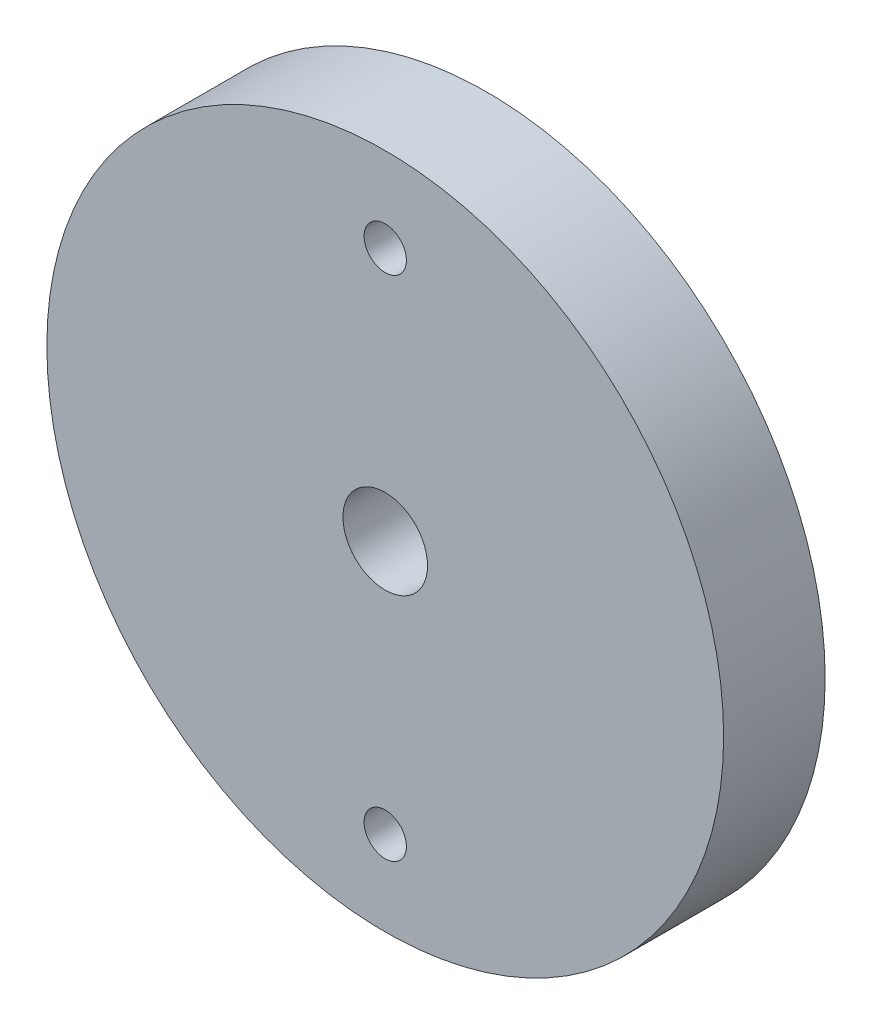
ISO-10303-21;
HEADER;
FILE_DESCRIPTION(('STEP AP214'),'2;1');
FILE_NAME('part.step','',(''),(''),'','','');
FILE_SCHEMA(('AUTOMOTIVE_DESIGN { 1 0 10303 214 1 1 1 1 }'));
ENDSEC;
DATA;
#1=APPLICATION_CONTEXT('core data for automotive mechanical design processes');
#2=APPLICATION_PROTOCOL_DEFINITION('international standard','automotive_design',2000,#1);
#3=PRODUCT_CONTEXT('',#1,'mechanical');
#4=PRODUCT('Part','Part','',(#3));
#5=PRODUCT_RELATED_PRODUCT_CATEGORY('part','',(#4));
#6=PRODUCT_DEFINITION_FORMATION('','',#4);
#7=PRODUCT_DEFINITION_CONTEXT('part definition',#1,'design');
#8=PRODUCT_DEFINITION('design','',#6,#7);
#9=PRODUCT_DEFINITION_SHAPE('','',#8);
#10=(LENGTH_UNIT() NAMED_UNIT(*) SI_UNIT(.MILLI.,.METRE.));
#11=(NAMED_UNIT(*) PLANE_ANGLE_UNIT() SI_UNIT($,.RADIAN.));
#12=(NAMED_UNIT(*) SI_UNIT($,.STERADIAN.) SOLID_ANGLE_UNIT());
#13=UNCERTAINTY_MEASURE_WITH_UNIT(LENGTH_MEASURE(1.E-05),#10,'distance_accuracy_value','');
#14=(GEOMETRIC_REPRESENTATION_CONTEXT(3) GLOBAL_UNCERTAINTY_ASSIGNED_CONTEXT((#13)) GLOBAL_UNIT_ASSIGNED_CONTEXT((#10,
#11,#12)) REPRESENTATION_CONTEXT('',''));
#15=CARTESIAN_POINT('',(0.,0.,0.));
#16=DIRECTION('',(0.,0.,1.));
#17=DIRECTION('',(1.,0.,0.));
#18=AXIS2_PLACEMENT_3D('',#15,#16,#17);
#19=CARTESIAN_POINT('',(0.,30.,2.));
#20=DIRECTION('',(0.,0.,1.));
#21=DIRECTION('',(1.,0.,0.));
#22=AXIS2_PLACEMENT_3D('',#19,#20,#21);
#23=CYLINDRICAL_SURFACE('',#22,2.5);
#24=CARTESIAN_POINT('',(0.,30.,12.));
#25=DIRECTION('',(0.,0.,1.));
#26=DIRECTION('',(1.,0.,0.));
#27=AXIS2_PLACEMENT_3D('',#24,#25,#26);
#28=CIRCLE('',#27,2.5);
#29=CARTESIAN_POINT('',(2.5,30.,12.));
#30=VERTEX_POINT('',#29);
#31=EDGE_CURVE('E70',#30,#30,#28,.T.);
#32=ORIENTED_EDGE('',*,*,#31,.T.);
#33=EDGE_LOOP('',(#32));
#34=FACE_BOUND('',#33,.T.);
#35=CARTESIAN_POINT('',(0.,30.,5.));
#36=DIRECTION('',(0.,0.,-1.));
#37=DIRECTION('',(-1.,0.,0.));
#38=AXIS2_PLACEMENT_3D('',#35,#36,#37);
#39=CIRCLE('',#38,2.5);
#40=CARTESIAN_POINT('',(-2.5,30.,5.));
#41=VERTEX_POINT('',#40);
#42=EDGE_CURVE('E35',#41,#41,#39,.F.);
#43=ORIENTED_EDGE('',*,*,#42,.F.);
#44=EDGE_LOOP('',(#43));
#45=FACE_BOUND('',#44,.T.);
#46=ADVANCED_FACE('F31',(#34,#45),#23,.F.);
#47=CARTESIAN_POINT('',(0.,-30.,2.));
#48=DIRECTION('',(0.,0.,1.));
#49=DIRECTION('',(1.,0.,0.));
#50=AXIS2_PLACEMENT_3D('',#47,#48,#49);
#51=CYLINDRICAL_SURFACE('',#50,2.5);
#52=CARTESIAN_POINT('',(0.,-30.,12.));
#53=DIRECTION('',(0.,0.,1.));
#54=DIRECTION('',(1.,0.,0.));
#55=AXIS2_PLACEMENT_3D('',#52,#53,#54);
#56=CIRCLE('',#55,2.5);
#57=CARTESIAN_POINT('',(2.5,-30.,12.));
#58=VERTEX_POINT('',#57);
#59=EDGE_CURVE('E55',#58,#58,#56,.T.);
#60=ORIENTED_EDGE('',*,*,#59,.T.);
#61=EDGE_LOOP('',(#60));
#62=FACE_BOUND('',#61,.T.);
#63=CARTESIAN_POINT('',(0.,-30.,5.));
#64=DIRECTION('',(0.,0.,-1.));
#65=DIRECTION('',(-1.,0.,0.));
#66=AXIS2_PLACEMENT_3D('',#63,#64,#65);
#67=CIRCLE('',#66,2.5);
#68=CARTESIAN_POINT('',(-2.5,-30.,5.));
#69=VERTEX_POINT('',#68);
#70=EDGE_CURVE('E49',#69,#69,#67,.F.);
#71=ORIENTED_EDGE('',*,*,#70,.F.);
#72=EDGE_LOOP('',(#71));
#73=FACE_BOUND('',#72,.T.);
#74=ADVANCED_FACE('F92',(#62,#73),#51,.F.);
#75=CARTESIAN_POINT('',(0.,0.,12.));
#76=DIRECTION('',(0.,0.,-1.));
#77=DIRECTION('',(-1.,0.,0.));
#78=AXIS2_PLACEMENT_3D('',#75,#76,#77);
#79=CYLINDRICAL_SURFACE('',#78,40.);
#80=CARTESIAN_POINT('',(0.,0.,12.));
#81=DIRECTION('',(0.,0.,1.));
#82=DIRECTION('',(1.,0.,0.));
#83=AXIS2_PLACEMENT_3D('',#80,#81,#82);
#84=CIRCLE('',#83,40.);
#85=CARTESIAN_POINT('',(40.,0.,12.));
#86=VERTEX_POINT('',#85);
#87=EDGE_CURVE('E10',#86,#86,#84,.T.);
#88=ORIENTED_EDGE('',*,*,#87,.F.);
#89=EDGE_LOOP('',(#88));
#90=FACE_BOUND('',#89,.T.);
#91=CARTESIAN_POINT('',(0.,0.,0.));
#92=DIRECTION('',(0.,0.,1.));
#93=DIRECTION('',(1.,0.,0.));
#94=AXIS2_PLACEMENT_3D('',#91,#92,#93);
#95=CIRCLE('',#94,40.);
#96=CARTESIAN_POINT('',(40.,0.,0.));
#97=VERTEX_POINT('',#96);
#98=EDGE_CURVE('E39',#97,#97,#95,.T.);
#99=ORIENTED_EDGE('',*,*,#98,.T.);
#100=EDGE_LOOP('',(#99));
#101=FACE_BOUND('',#100,.T.);
#102=ADVANCED_FACE('F33',(#90,#101),#79,.T.);
#103=CARTESIAN_POINT('',(0.,0.,12.));
#104=DIRECTION('',(0.,0.,1.));
#105=DIRECTION('',(1.,0.,0.));
#106=AXIS2_PLACEMENT_3D('',#103,#104,#105);
#107=PLANE('',#106);
#108=ORIENTED_EDGE('',*,*,#59,.F.);
#109=EDGE_LOOP('',(#108));
#110=FACE_BOUND('',#109,.T.);
#111=ORIENTED_EDGE('',*,*,#31,.F.);
#112=EDGE_LOOP('',(#111));
#113=FACE_BOUND('',#112,.T.);
#114=CARTESIAN_POINT('',(0.,0.,12.));
#115=DIRECTION('',(0.,0.,1.));
#116=DIRECTION('',(1.,0.,0.));
#117=AXIS2_PLACEMENT_3D('',#114,#115,#116);
#118=CIRCLE('',#117,5.);
#119=CARTESIAN_POINT('',(5.,0.,12.));
#120=VERTEX_POINT('',#119);
#121=EDGE_CURVE('E47',#120,#120,#118,.T.);
#122=ORIENTED_EDGE('',*,*,#121,.F.);
#123=EDGE_LOOP('',(#122));
#124=FACE_BOUND('',#123,.T.);
#125=ORIENTED_EDGE('',*,*,#87,.T.);
#126=EDGE_LOOP('',(#125));
#127=FACE_BOUND('',#126,.T.);
#128=ADVANCED_FACE('F82',(#110,#113,#124,#127),#107,.T.);
#129=CARTESIAN_POINT('',(0.,0.,0.));
#130=DIRECTION('',(0.,0.,1.));
#131=DIRECTION('',(1.,0.,0.));
#132=AXIS2_PLACEMENT_3D('',#129,#130,#131);
#133=PLANE('',#132);
#134=CARTESIAN_POINT('',(0.,-30.,0.));
#135=DIRECTION('',(0.,0.,-1.));
#136=DIRECTION('',(-1.,0.,0.));
#137=AXIS2_PLACEMENT_3D('',#134,#135,#136);
#138=CIRCLE('',#137,4.75);
#139=CARTESIAN_POINT('',(-4.75,-30.,0.));
#140=VERTEX_POINT('',#139);
#141=EDGE_CURVE('E57',#140,#140,#138,.T.);
#142=ORIENTED_EDGE('',*,*,#141,.F.);
#143=EDGE_LOOP('',(#142));
#144=FACE_BOUND('',#143,.T.);
#145=CARTESIAN_POINT('',(0.,30.,0.));
#146=DIRECTION('',(0.,0.,-1.));
#147=DIRECTION('',(-1.,0.,0.));
#148=AXIS2_PLACEMENT_3D('',#145,#146,#147);
#149=CIRCLE('',#148,4.75);
#150=CARTESIAN_POINT('',(-4.75,30.,0.));
#151=VERTEX_POINT('',#150);
#152=EDGE_CURVE('E67',#151,#151,#149,.T.);
#153=ORIENTED_EDGE('',*,*,#152,.F.);
#154=EDGE_LOOP('',(#153));
#155=FACE_BOUND('',#154,.T.);
#156=ORIENTED_EDGE('',*,*,#98,.F.);
#157=EDGE_LOOP('',(#156));
#158=FACE_BOUND('',#157,.T.);
#159=ADVANCED_FACE('F84',(#144,#155,#158),#133,.F.);
#160=CARTESIAN_POINT('',(0.,0.,2.));
#161=DIRECTION('',(0.,0.,1.));
#162=DIRECTION('',(1.,0.,0.));
#163=AXIS2_PLACEMENT_3D('',#160,#161,#162);
#164=CYLINDRICAL_SURFACE('',#163,5.);
#165=CARTESIAN_POINT('',(0.,0.,2.));
#166=DIRECTION('',(0.,0.,1.));
#167=DIRECTION('',(1.,0.,0.));
#168=AXIS2_PLACEMENT_3D('',#165,#166,#167);
#169=CIRCLE('',#168,5.);
#170=CARTESIAN_POINT('',(5.,0.,2.));
#171=VERTEX_POINT('',#170);
#172=EDGE_CURVE('E44',#171,#171,#169,.T.);
#173=ORIENTED_EDGE('',*,*,#172,.F.);
#174=EDGE_LOOP('',(#173));
#175=FACE_BOUND('',#174,.T.);
#176=ORIENTED_EDGE('',*,*,#121,.T.);
#177=EDGE_LOOP('',(#176));
#178=FACE_BOUND('',#177,.T.);
#179=ADVANCED_FACE('F80',(#175,#178),#164,.F.);
#180=CARTESIAN_POINT('',(0.,0.,2.));
#181=DIRECTION('',(0.,0.,1.));
#182=DIRECTION('',(1.,0.,0.));
#183=AXIS2_PLACEMENT_3D('',#180,#181,#182);
#184=PLANE('',#183);
#185=ORIENTED_EDGE('',*,*,#172,.T.);
#186=EDGE_LOOP('',(#185));
#187=FACE_BOUND('',#186,.T.);
#188=ADVANCED_FACE('F110',(#187),#184,.T.);
#189=CARTESIAN_POINT('',(0.,-30.,5.));
#190=DIRECTION('',(0.,0.,-1.));
#191=DIRECTION('',(-1.,0.,0.));
#192=AXIS2_PLACEMENT_3D('',#189,#190,#191);
#193=PLANE('',#192);
#194=CARTESIAN_POINT('',(0.,-30.,5.));
#195=DIRECTION('',(0.,0.,-1.));
#196=DIRECTION('',(-1.,0.,0.));
#197=AXIS2_PLACEMENT_3D('',#194,#195,#196);
#198=CIRCLE('',#197,4.75);
#199=CARTESIAN_POINT('',(-4.75,-30.,5.));
#200=VERTEX_POINT('',#199);
#201=EDGE_CURVE('E51',#200,#200,#198,.T.);
#202=ORIENTED_EDGE('',*,*,#201,.T.);
#203=EDGE_LOOP('',(#202));
#204=FACE_BOUND('',#203,.T.);
#205=ORIENTED_EDGE('',*,*,#70,.T.);
#206=EDGE_LOOP('',(#205));
#207=FACE_BOUND('',#206,.T.);
#208=ADVANCED_FACE('F112',(#204,#207),#193,.T.);
#209=CARTESIAN_POINT('',(0.,-30.,5.));
#210=DIRECTION('',(0.,0.,-1.));
#211=DIRECTION('',(-1.,0.,0.));
#212=AXIS2_PLACEMENT_3D('',#209,#210,#211);
#213=CYLINDRICAL_SURFACE('',#212,4.75);
#214=ORIENTED_EDGE('',*,*,#201,.F.);
#215=EDGE_LOOP('',(#214));
#216=FACE_BOUND('',#215,.T.);
#217=ORIENTED_EDGE('',*,*,#141,.T.);
#218=EDGE_LOOP('',(#217));
#219=FACE_BOUND('',#218,.T.);
#220=ADVANCED_FACE('F129',(#216,#219),#213,.F.);
#221=CARTESIAN_POINT('',(0.,30.,5.));
#222=DIRECTION('',(0.,0.,-1.));
#223=DIRECTION('',(-1.,0.,0.));
#224=AXIS2_PLACEMENT_3D('',#221,#222,#223);
#225=PLANE('',#224);
#226=CARTESIAN_POINT('',(0.,30.,5.));
#227=DIRECTION('',(0.,0.,-1.));
#228=DIRECTION('',(-1.,0.,0.));
#229=AXIS2_PLACEMENT_3D('',#226,#227,#228);
#230=CIRCLE('',#229,4.75);
#231=CARTESIAN_POINT('',(-4.75,30.,5.));
#232=VERTEX_POINT('',#231);
#233=EDGE_CURVE('E62',#232,#232,#230,.T.);
#234=ORIENTED_EDGE('',*,*,#233,.T.);
#235=EDGE_LOOP('',(#234));
#236=FACE_BOUND('',#235,.T.);
#237=ORIENTED_EDGE('',*,*,#42,.T.);
#238=EDGE_LOOP('',(#237));
#239=FACE_BOUND('',#238,.T.);
#240=ADVANCED_FACE('F136',(#236,#239),#225,.T.);
#241=CARTESIAN_POINT('',(0.,30.,5.));
#242=DIRECTION('',(0.,0.,-1.));
#243=DIRECTION('',(-1.,0.,0.));
#244=AXIS2_PLACEMENT_3D('',#241,#242,#243);
#245=CYLINDRICAL_SURFACE('',#244,4.75);
#246=ORIENTED_EDGE('',*,*,#233,.F.);
#247=EDGE_LOOP('',(#246));
#248=FACE_BOUND('',#247,.T.);
#249=ORIENTED_EDGE('',*,*,#152,.T.);
#250=EDGE_LOOP('',(#249));
#251=FACE_BOUND('',#250,.T.);
#252=ADVANCED_FACE('F107',(#248,#251),#245,.F.);
#253=CLOSED_SHELL('',(#46,#74,#102,#128,#159,#179,#188,#208,#220,#240,#252));
#254=MANIFOLD_SOLID_BREP('B2',#253);
#255=ADVANCED_BREP_SHAPE_REPRESENTATION('',(#18,#254),#14);
#256=SHAPE_DEFINITION_REPRESENTATION(#9,#255);
ENDSEC;
END-ISO-10303-21;
